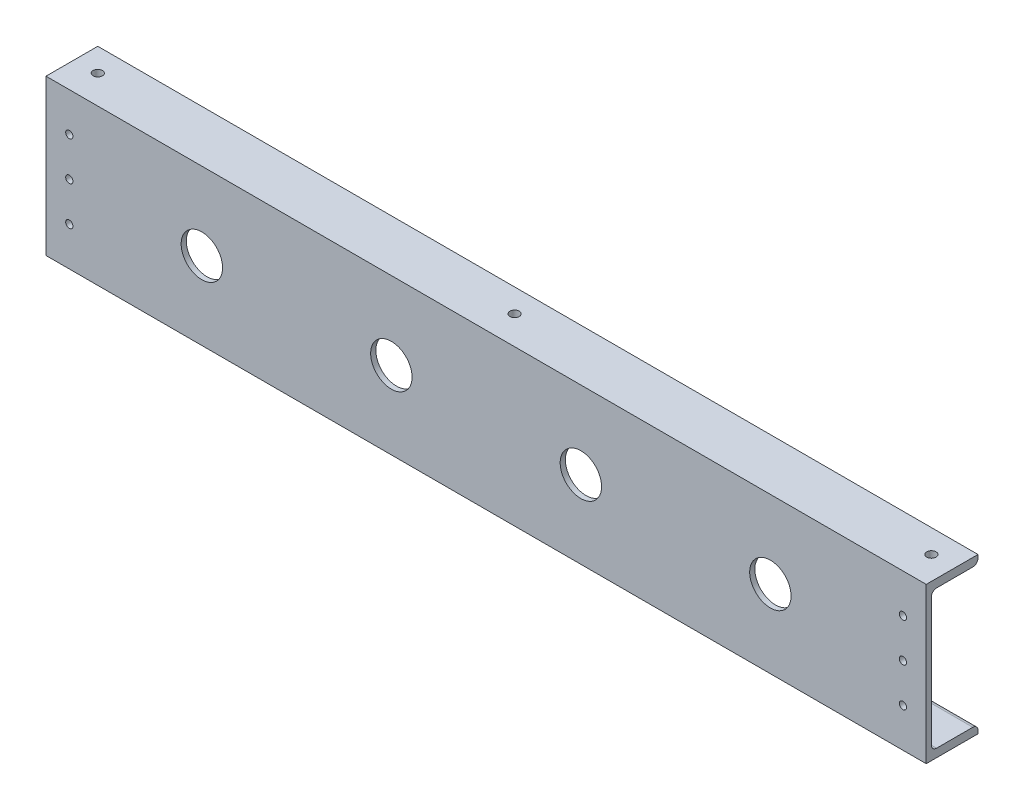
ISO-10303-21;
HEADER;
FILE_DESCRIPTION(('STEP AP214'),'2;1');
FILE_NAME('part.step','',(''),(''),'','','');
FILE_SCHEMA(('AUTOMOTIVE_DESIGN { 1 0 10303 214 1 1 1 1 }'));
ENDSEC;
DATA;
#1=APPLICATION_CONTEXT('core data for automotive mechanical design processes');
#2=APPLICATION_PROTOCOL_DEFINITION('international standard','automotive_design',2000,#1);
#3=PRODUCT_CONTEXT('',#1,'mechanical');
#4=PRODUCT('Part','Part','',(#3));
#5=PRODUCT_RELATED_PRODUCT_CATEGORY('part','',(#4));
#6=PRODUCT_DEFINITION_FORMATION('','',#4);
#7=PRODUCT_DEFINITION_CONTEXT('part definition',#1,'design');
#8=PRODUCT_DEFINITION('design','',#6,#7);
#9=PRODUCT_DEFINITION_SHAPE('','',#8);
#10=(LENGTH_UNIT() NAMED_UNIT(*) SI_UNIT(.MILLI.,.METRE.));
#11=(NAMED_UNIT(*) PLANE_ANGLE_UNIT() SI_UNIT($,.RADIAN.));
#12=(NAMED_UNIT(*) SI_UNIT($,.STERADIAN.) SOLID_ANGLE_UNIT());
#13=UNCERTAINTY_MEASURE_WITH_UNIT(LENGTH_MEASURE(1.E-05),#10,'distance_accuracy_value','');
#14=(GEOMETRIC_REPRESENTATION_CONTEXT(3) GLOBAL_UNCERTAINTY_ASSIGNED_CONTEXT((#13)) GLOBAL_UNIT_ASSIGNED_CONTEXT((#10,
#11,#12)) REPRESENTATION_CONTEXT('',''));
#15=CARTESIAN_POINT('',(0.,0.,0.));
#16=DIRECTION('',(0.,0.,1.));
#17=DIRECTION('',(1.,0.,0.));
#18=AXIS2_PLACEMENT_3D('',#15,#16,#17);
#19=CARTESIAN_POINT('',(301.,-36.1204013377926,206.622073578595));
#20=DIRECTION('',(0.,0.,-1.));
#21=DIRECTION('',(0.,1.,0.));
#22=AXIS2_PLACEMENT_3D('',#19,#20,#21);
#23=CYLINDRICAL_SURFACE('',#22,39.9999999999999);
#24=CARTESIAN_POINT('',(301.,-36.1204013377926,176.622073578595));
#25=DIRECTION('',(0.,0.,-1.));
#26=DIRECTION('',(0.,1.,0.));
#27=AXIS2_PLACEMENT_3D('',#24,#25,#26);
#28=CIRCLE('',#27,39.9999999999999);
#29=CARTESIAN_POINT('',(301.,3.87959866220729,176.622073578595));
#30=VERTEX_POINT('',#29);
#31=EDGE_CURVE('E40',#30,#30,#28,.T.);
#32=ORIENTED_EDGE('',*,*,#31,.T.);
#33=EDGE_LOOP('',(#32));
#34=FACE_BOUND('',#33,.T.);
#35=CARTESIAN_POINT('',(301.,-36.1204013377926,186.622073578595));
#36=DIRECTION('',(0.,0.,-1.));
#37=DIRECTION('',(-1.,0.,0.));
#38=AXIS2_PLACEMENT_3D('',#35,#36,#37);
#39=CIRCLE('',#38,39.9999999999999);
#40=CARTESIAN_POINT('',(261.,-36.1204013377926,186.622073578595));
#41=VERTEX_POINT('',#40);
#42=EDGE_CURVE('E11',#41,#41,#39,.T.);
#43=ORIENTED_EDGE('',*,*,#42,.F.);
#44=EDGE_LOOP('',(#43));
#45=FACE_BOUND('',#44,.T.);
#46=ADVANCED_FACE('F32',(#34,#45),#23,.F.);
#47=CARTESIAN_POINT('',(667.,-36.1204013377926,206.622073578595));
#48=DIRECTION('',(0.,0.,-1.));
#49=DIRECTION('',(0.,1.,0.));
#50=AXIS2_PLACEMENT_3D('',#47,#48,#49);
#51=CYLINDRICAL_SURFACE('',#50,39.9999999999999);
#52=CARTESIAN_POINT('',(667.,-36.1204013377926,176.622073578595));
#53=DIRECTION('',(0.,0.,-1.));
#54=DIRECTION('',(0.,1.,0.));
#55=AXIS2_PLACEMENT_3D('',#52,#53,#54);
#56=CIRCLE('',#55,39.9999999999999);
#57=CARTESIAN_POINT('',(667.,3.87959866220729,176.622073578595));
#58=VERTEX_POINT('',#57);
#59=EDGE_CURVE('E215',#58,#58,#56,.T.);
#60=ORIENTED_EDGE('',*,*,#59,.T.);
#61=EDGE_LOOP('',(#60));
#62=FACE_BOUND('',#61,.T.);
#63=CARTESIAN_POINT('',(667.,-36.1204013377926,186.622073578595));
#64=DIRECTION('',(0.,0.,-1.));
#65=DIRECTION('',(-1.,0.,0.));
#66=AXIS2_PLACEMENT_3D('',#63,#64,#65);
#67=CIRCLE('',#66,39.9999999999999);
#68=CARTESIAN_POINT('',(627.,-36.1204013377926,186.622073578595));
#69=VERTEX_POINT('',#68);
#70=EDGE_CURVE('E218',#69,#69,#67,.T.);
#71=ORIENTED_EDGE('',*,*,#70,.F.);
#72=EDGE_LOOP('',(#71));
#73=FACE_BOUND('',#72,.T.);
#74=ADVANCED_FACE('F241',(#62,#73),#51,.F.);
#75=CARTESIAN_POINT('',(1655.,93.8795986622074,131.622073578595));
#76=DIRECTION('',(0.,1.,0.));
#77=DIRECTION('',(0.,0.,1.));
#78=AXIS2_PLACEMENT_3D('',#75,#76,#77);
#79=CYLINDRICAL_SURFACE('',#78,9.00000000000001);
#80=CARTESIAN_POINT('',(1655.,113.879598662207,131.622073578595));
#81=DIRECTION('',(0.,1.,0.));
#82=DIRECTION('',(0.,0.,1.));
#83=AXIS2_PLACEMENT_3D('',#80,#81,#82);
#84=CIRCLE('',#83,9.00000000000001);
#85=CARTESIAN_POINT('',(1655.,113.879598662207,140.622073578595));
#86=VERTEX_POINT('',#85);
#87=EDGE_CURVE('E204',#86,#86,#84,.T.);
#88=ORIENTED_EDGE('',*,*,#87,.T.);
#89=EDGE_LOOP('',(#88));
#90=FACE_BOUND('',#89,.T.);
#91=CARTESIAN_POINT('',(1655.,97.8795986622074,131.622073578595));
#92=DIRECTION('',(0.,1.,0.));
#93=DIRECTION('',(0.,0.,1.));
#94=AXIS2_PLACEMENT_3D('',#91,#92,#93);
#95=CIRCLE('',#94,9.00000000000001);
#96=CARTESIAN_POINT('',(1655.,97.8795986622074,140.622073578595));
#97=VERTEX_POINT('',#96);
#98=EDGE_CURVE('E212',#97,#97,#95,.T.);
#99=ORIENTED_EDGE('',*,*,#98,.F.);
#100=EDGE_LOOP('',(#99));
#101=FACE_BOUND('',#100,.T.);
#102=ADVANCED_FACE('F245',(#90,#101),#79,.F.);
#103=CARTESIAN_POINT('',(1700.,107.879598662207,86.6220735785954));
#104=DIRECTION('',(0.,0.,1.));
#105=DIRECTION('',(1.,0.,0.));
#106=AXIS2_PLACEMENT_3D('',#103,#104,#105);
#107=PLANE('',#106);
#108=DIRECTION('',(0.,1.,0.));
#109=VECTOR('',#108,1.);
#110=CARTESIAN_POINT('',(0.,107.879598662207,86.6220735785954));
#111=LINE('',#110,#109);
#112=CARTESIAN_POINT('',(0.,107.879598662207,86.6220735785954));
#113=VERTEX_POINT('',#112);
#114=CARTESIAN_POINT('',(0.,113.879598662207,86.6220735785954));
#115=VERTEX_POINT('',#114);
#116=EDGE_CURVE('E154',#113,#115,#111,.T.);
#117=ORIENTED_EDGE('',*,*,#116,.T.);
#118=DIRECTION('',(-1.,0.,0.));
#119=VECTOR('',#118,1.);
#120=CARTESIAN_POINT('',(1700.,113.879598662207,86.6220735785954));
#121=LINE('',#120,#119);
#122=CARTESIAN_POINT('',(1700.,113.879598662207,86.6220735785954));
#123=VERTEX_POINT('',#122);
#124=EDGE_CURVE('E202',#123,#115,#121,.T.);
#125=ORIENTED_EDGE('',*,*,#124,.F.);
#126=DIRECTION('',(0.,1.,0.));
#127=VECTOR('',#126,1.);
#128=CARTESIAN_POINT('',(1700.,107.879598662207,86.6220735785954));
#129=LINE('',#128,#127);
#130=CARTESIAN_POINT('',(1700.,107.879598662207,86.6220735785954));
#131=VERTEX_POINT('',#130);
#132=EDGE_CURVE('E177',#131,#123,#129,.T.);
#133=ORIENTED_EDGE('',*,*,#132,.F.);
#134=DIRECTION('',(-1.,0.,0.));
#135=VECTOR('',#134,1.);
#136=CARTESIAN_POINT('',(1700.,107.879598662207,86.6220735785954));
#137=LINE('',#136,#135);
#138=EDGE_CURVE('E150',#131,#113,#137,.T.);
#139=ORIENTED_EDGE('',*,*,#138,.T.);
#140=EDGE_LOOP('',(#117,#125,#133,#139));
#141=FACE_BOUND('',#140,.T.);
#142=ADVANCED_FACE('F250',(#141),#107,.F.);
#143=CARTESIAN_POINT('',(1700.,113.879598662207,86.6220735785954));
#144=DIRECTION('',(0.,-1.,0.));
#145=DIRECTION('',(0.,0.,-1.));
#146=AXIS2_PLACEMENT_3D('',#143,#144,#145);
#147=PLANE('',#146);
#148=CARTESIAN_POINT('',(850.,113.879598662207,131.622073578595));
#149=DIRECTION('',(0.,1.,0.));
#150=DIRECTION('',(0.,0.,1.));
#151=AXIS2_PLACEMENT_3D('',#148,#149,#150);
#152=CIRCLE('',#151,9.00000000000001);
#153=CARTESIAN_POINT('',(850.,113.879598662207,140.622073578595));
#154=VERTEX_POINT('',#153);
#155=EDGE_CURVE('E350',#154,#154,#152,.T.);
#156=ORIENTED_EDGE('',*,*,#155,.F.);
#157=EDGE_LOOP('',(#156));
#158=FACE_BOUND('',#157,.T.);
#159=CARTESIAN_POINT('',(45.,113.879598662207,131.622073578595));
#160=DIRECTION('',(0.,1.,0.));
#161=DIRECTION('',(0.,0.,1.));
#162=AXIS2_PLACEMENT_3D('',#159,#160,#161);
#163=CIRCLE('',#162,9.00000000000001);
#164=CARTESIAN_POINT('',(45.,113.879598662207,140.622073578595));
#165=VERTEX_POINT('',#164);
#166=EDGE_CURVE('E209',#165,#165,#163,.T.);
#167=ORIENTED_EDGE('',*,*,#166,.F.);
#168=EDGE_LOOP('',(#167));
#169=FACE_BOUND('',#168,.T.);
#170=DIRECTION('',(0.,0.,1.));
#171=VECTOR('',#170,1.);
#172=CARTESIAN_POINT('',(0.,113.879598662207,86.6220735785954));
#173=LINE('',#172,#171);
#174=CARTESIAN_POINT('',(0.,113.879598662207,186.622073578595));
#175=VERTEX_POINT('',#174);
#176=EDGE_CURVE('E157',#115,#175,#173,.T.);
#177=ORIENTED_EDGE('',*,*,#176,.T.);
#178=DIRECTION('',(-1.,0.,0.));
#179=VECTOR('',#178,1.);
#180=CARTESIAN_POINT('',(1700.,113.879598662207,186.622073578595));
#181=LINE('',#180,#179);
#182=CARTESIAN_POINT('',(1700.,113.879598662207,186.622073578595));
#183=VERTEX_POINT('',#182);
#184=EDGE_CURVE('E199',#183,#175,#181,.T.);
#185=ORIENTED_EDGE('',*,*,#184,.F.);
#186=DIRECTION('',(0.,0.,1.));
#187=VECTOR('',#186,1.);
#188=CARTESIAN_POINT('',(1700.,113.879598662207,86.6220735785954));
#189=LINE('',#188,#187);
#190=EDGE_CURVE('E104',#123,#183,#189,.T.);
#191=ORIENTED_EDGE('',*,*,#190,.F.);
#192=ORIENTED_EDGE('',*,*,#124,.T.);
#193=EDGE_LOOP('',(#177,#185,#191,#192));
#194=FACE_BOUND('',#193,.T.);
#195=ORIENTED_EDGE('',*,*,#87,.F.);
#196=EDGE_LOOP('',(#195));
#197=FACE_BOUND('',#196,.T.);
#198=ADVANCED_FACE('F257',(#158,#169,#194,#197),#147,.F.);
#199=CARTESIAN_POINT('',(1700.,113.879598662207,186.622073578595));
#200=DIRECTION('',(0.,0.,-1.));
#201=DIRECTION('',(-1.,0.,0.));
#202=AXIS2_PLACEMENT_3D('',#199,#200,#201);
#203=PLANE('',#202);
#204=CARTESIAN_POINT('',(1033.,-36.1204013377926,186.622073578595));
#205=DIRECTION('',(0.,0.,-1.));
#206=DIRECTION('',(-1.,0.,0.));
#207=AXIS2_PLACEMENT_3D('',#204,#205,#206);
#208=CIRCLE('',#207,39.9999999999999);
#209=CARTESIAN_POINT('',(993.,-36.1204013377926,186.622073578595));
#210=VERTEX_POINT('',#209);
#211=EDGE_CURVE('E359',#210,#210,#208,.T.);
#212=ORIENTED_EDGE('',*,*,#211,.T.);
#213=EDGE_LOOP('',(#212));
#214=FACE_BOUND('',#213,.T.);
#215=CARTESIAN_POINT('',(1399.,-36.1204013377926,186.622073578595));
#216=DIRECTION('',(0.,0.,-1.));
#217=DIRECTION('',(-1.,0.,0.));
#218=AXIS2_PLACEMENT_3D('',#215,#216,#217);
#219=CIRCLE('',#218,39.9999999999999);
#220=CARTESIAN_POINT('',(1359.,-36.1204013377926,186.622073578595));
#221=VERTEX_POINT('',#220);
#222=EDGE_CURVE('E353',#221,#221,#219,.T.);
#223=ORIENTED_EDGE('',*,*,#222,.T.);
#224=EDGE_LOOP('',(#223));
#225=FACE_BOUND('',#224,.T.);
#226=CARTESIAN_POINT('',(44.9999999999999,38.8795986622074,186.622073578595));
#227=DIRECTION('',(0.,0.,-1.));
#228=DIRECTION('',(-1.,0.,0.));
#229=AXIS2_PLACEMENT_3D('',#226,#227,#228);
#230=CIRCLE('',#229,6.99999999999993);
#231=CARTESIAN_POINT('',(38.,38.8795986622074,186.622073578595));
#232=VERTEX_POINT('',#231);
#233=EDGE_CURVE('E340',#232,#232,#230,.T.);
#234=ORIENTED_EDGE('',*,*,#233,.T.);
#235=EDGE_LOOP('',(#234));
#236=FACE_BOUND('',#235,.T.);
#237=CARTESIAN_POINT('',(45.0000000000001,-36.1204013377926,186.622073578595));
#238=DIRECTION('',(0.,0.,-1.));
#239=DIRECTION('',(-1.,0.,0.));
#240=AXIS2_PLACEMENT_3D('',#237,#238,#239);
#241=CIRCLE('',#240,6.99999999999993);
#242=CARTESIAN_POINT('',(38.0000000000002,-36.1204013377926,186.622073578595));
#243=VERTEX_POINT('',#242);
#244=EDGE_CURVE('E334',#243,#243,#241,.T.);
#245=ORIENTED_EDGE('',*,*,#244,.T.);
#246=EDGE_LOOP('',(#245));
#247=FACE_BOUND('',#246,.T.);
#248=CARTESIAN_POINT('',(44.9999999999999,-111.120401337793,186.622073578595));
#249=DIRECTION('',(0.,0.,-1.));
#250=DIRECTION('',(-1.,0.,0.));
#251=AXIS2_PLACEMENT_3D('',#248,#249,#250);
#252=CIRCLE('',#251,6.99999999999992);
#253=CARTESIAN_POINT('',(38.,-111.120401337793,186.622073578595));
#254=VERTEX_POINT('',#253);
#255=EDGE_CURVE('E208',#254,#254,#252,.T.);
#256=ORIENTED_EDGE('',*,*,#255,.T.);
#257=EDGE_LOOP('',(#256));
#258=FACE_BOUND('',#257,.T.);
#259=CARTESIAN_POINT('',(1655.,38.8795986622074,186.622073578595));
#260=DIRECTION('',(0.,0.,1.));
#261=DIRECTION('',(1.,0.,0.));
#262=AXIS2_PLACEMENT_3D('',#259,#260,#261);
#263=CIRCLE('',#262,6.99999999999993);
#264=CARTESIAN_POINT('',(1662.,38.8795986622074,186.622073578595));
#265=VERTEX_POINT('',#264);
#266=EDGE_CURVE('E324',#265,#265,#263,.T.);
#267=ORIENTED_EDGE('',*,*,#266,.F.);
#268=EDGE_LOOP('',(#267));
#269=FACE_BOUND('',#268,.T.);
#270=CARTESIAN_POINT('',(1655.,-36.1204013377926,186.622073578595));
#271=DIRECTION('',(0.,0.,1.));
#272=DIRECTION('',(1.,0.,0.));
#273=AXIS2_PLACEMENT_3D('',#270,#271,#272);
#274=CIRCLE('',#273,6.99999999999993);
#275=CARTESIAN_POINT('',(1662.,-36.1204013377926,186.622073578595));
#276=VERTEX_POINT('',#275);
#277=EDGE_CURVE('E318',#276,#276,#274,.T.);
#278=ORIENTED_EDGE('',*,*,#277,.F.);
#279=EDGE_LOOP('',(#278));
#280=FACE_BOUND('',#279,.T.);
#281=CARTESIAN_POINT('',(1655.,-111.120401337793,186.622073578595));
#282=DIRECTION('',(0.,0.,1.));
#283=DIRECTION('',(1.,0.,0.));
#284=AXIS2_PLACEMENT_3D('',#281,#282,#283);
#285=CIRCLE('',#284,6.99999999999992);
#286=CARTESIAN_POINT('',(1662.,-111.120401337793,186.622073578595));
#287=VERTEX_POINT('',#286);
#288=EDGE_CURVE('E311',#287,#287,#285,.T.);
#289=ORIENTED_EDGE('',*,*,#288,.F.);
#290=EDGE_LOOP('',(#289));
#291=FACE_BOUND('',#290,.T.);
#292=DIRECTION('',(0.,-1.,0.));
#293=VECTOR('',#292,1.);
#294=CARTESIAN_POINT('',(0.,113.879598662207,186.622073578595));
#295=LINE('',#294,#293);
#296=CARTESIAN_POINT('',(0.,-186.120401337793,186.622073578595));
#297=VERTEX_POINT('',#296);
#298=EDGE_CURVE('E160',#175,#297,#295,.T.);
#299=ORIENTED_EDGE('',*,*,#298,.T.);
#300=DIRECTION('',(-1.,0.,0.));
#301=VECTOR('',#300,1.);
#302=CARTESIAN_POINT('',(1700.,-186.120401337793,186.622073578595));
#303=LINE('',#302,#301);
#304=CARTESIAN_POINT('',(1700.,-186.120401337793,186.622073578595));
#305=VERTEX_POINT('',#304);
#306=EDGE_CURVE('E196',#305,#297,#303,.T.);
#307=ORIENTED_EDGE('',*,*,#306,.F.);
#308=DIRECTION('',(0.,-1.,0.));
#309=VECTOR('',#308,1.);
#310=CARTESIAN_POINT('',(1700.,113.879598662207,186.622073578595));
#311=LINE('',#310,#309);
#312=EDGE_CURVE('E307',#183,#305,#311,.T.);
#313=ORIENTED_EDGE('',*,*,#312,.F.);
#314=ORIENTED_EDGE('',*,*,#184,.T.);
#315=EDGE_LOOP('',(#299,#307,#313,#314));
#316=FACE_BOUND('',#315,.T.);
#317=ORIENTED_EDGE('',*,*,#70,.T.);
#318=EDGE_LOOP('',(#317));
#319=FACE_BOUND('',#318,.T.);
#320=ORIENTED_EDGE('',*,*,#42,.T.);
#321=EDGE_LOOP('',(#320));
#322=FACE_BOUND('',#321,.T.);
#323=ADVANCED_FACE('F261',(#214,#225,#236,#247,#258,#269,#280,#291,#316,#319,#322),#203,.F.);
#324=CARTESIAN_POINT('',(1700.,-186.120401337793,186.622073578595));
#325=DIRECTION('',(0.,1.,0.));
#326=DIRECTION('',(0.,0.,1.));
#327=AXIS2_PLACEMENT_3D('',#324,#325,#326);
#328=PLANE('',#327);
#329=DIRECTION('',(0.,0.,-1.));
#330=VECTOR('',#329,1.);
#331=CARTESIAN_POINT('',(0.,-186.120401337793,186.622073578595));
#332=LINE('',#331,#330);
#333=CARTESIAN_POINT('',(0.,-186.120401337793,86.6220735785954));
#334=VERTEX_POINT('',#333);
#335=EDGE_CURVE('E162',#297,#334,#332,.T.);
#336=ORIENTED_EDGE('',*,*,#335,.T.);
#337=DIRECTION('',(-1.,0.,0.));
#338=VECTOR('',#337,1.);
#339=CARTESIAN_POINT('',(1700.,-186.120401337793,86.6220735785954));
#340=LINE('',#339,#338);
#341=CARTESIAN_POINT('',(1700.,-186.120401337793,86.6220735785954));
#342=VERTEX_POINT('',#341);
#343=EDGE_CURVE('E193',#342,#334,#340,.T.);
#344=ORIENTED_EDGE('',*,*,#343,.F.);
#345=DIRECTION('',(0.,0.,-1.));
#346=VECTOR('',#345,1.);
#347=CARTESIAN_POINT('',(1700.,-186.120401337793,186.622073578595));
#348=LINE('',#347,#346);
#349=EDGE_CURVE('E305',#305,#342,#348,.T.);
#350=ORIENTED_EDGE('',*,*,#349,.F.);
#351=ORIENTED_EDGE('',*,*,#306,.T.);
#352=EDGE_LOOP('',(#336,#344,#350,#351));
#353=FACE_BOUND('',#352,.T.);
#354=ADVANCED_FACE('F265',(#353),#328,.F.);
#355=CARTESIAN_POINT('',(1700.,-186.120401337793,86.6220735785954));
#356=DIRECTION('',(0.,0.,1.));
#357=DIRECTION('',(1.,0.,0.));
#358=AXIS2_PLACEMENT_3D('',#355,#356,#357);
#359=PLANE('',#358);
#360=DIRECTION('',(0.,1.,0.));
#361=VECTOR('',#360,1.);
#362=CARTESIAN_POINT('',(0.,-186.120401337793,86.6220735785954));
#363=LINE('',#362,#361);
#364=CARTESIAN_POINT('',(0.,-180.120401337793,86.6220735785954));
#365=VERTEX_POINT('',#364);
#366=EDGE_CURVE('E164',#334,#365,#363,.T.);
#367=ORIENTED_EDGE('',*,*,#366,.T.);
#368=DIRECTION('',(-1.,0.,0.));
#369=VECTOR('',#368,1.);
#370=CARTESIAN_POINT('',(1700.,-180.120401337793,86.6220735785954));
#371=LINE('',#370,#369);
#372=CARTESIAN_POINT('',(1700.,-180.120401337793,86.6220735785954));
#373=VERTEX_POINT('',#372);
#374=EDGE_CURVE('E190',#373,#365,#371,.T.);
#375=ORIENTED_EDGE('',*,*,#374,.F.);
#376=DIRECTION('',(0.,1.,0.));
#377=VECTOR('',#376,1.);
#378=CARTESIAN_POINT('',(1700.,-186.120401337793,86.6220735785954));
#379=LINE('',#378,#377);
#380=EDGE_CURVE('E303',#342,#373,#379,.T.);
#381=ORIENTED_EDGE('',*,*,#380,.F.);
#382=ORIENTED_EDGE('',*,*,#343,.T.);
#383=EDGE_LOOP('',(#367,#375,#381,#382));
#384=FACE_BOUND('',#383,.T.);
#385=ADVANCED_FACE('F269',(#384),#359,.F.);
#386=CARTESIAN_POINT('',(1700.,-180.120401337793,96.6220735785954));
#387=DIRECTION('',(-1.,0.,0.));
#388=DIRECTION('',(0.,0.,1.));
#389=AXIS2_PLACEMENT_3D('',#386,#387,#388);
#390=CYLINDRICAL_SURFACE('',#389,10.);
#391=CARTESIAN_POINT('',(0.,-180.120401337793,96.6220735785954));
#392=DIRECTION('',(1.,0.,0.));
#393=DIRECTION('',(0.,0.,-1.));
#394=AXIS2_PLACEMENT_3D('',#391,#392,#393);
#395=CIRCLE('',#394,10.);
#396=CARTESIAN_POINT('',(0.,-170.120401337793,96.6220735785954));
#397=VERTEX_POINT('',#396);
#398=EDGE_CURVE('E166',#365,#397,#395,.T.);
#399=ORIENTED_EDGE('',*,*,#398,.T.);
#400=DIRECTION('',(-1.,0.,0.));
#401=VECTOR('',#400,1.);
#402=CARTESIAN_POINT('',(1700.,-170.120401337793,96.6220735785954));
#403=LINE('',#402,#401);
#404=CARTESIAN_POINT('',(1700.,-170.120401337793,96.6220735785954));
#405=VERTEX_POINT('',#404);
#406=EDGE_CURVE('E187',#405,#397,#403,.T.);
#407=ORIENTED_EDGE('',*,*,#406,.F.);
#408=CARTESIAN_POINT('',(1700.,-180.120401337793,96.6220735785954));
#409=DIRECTION('',(1.,0.,0.));
#410=DIRECTION('',(0.,0.,-1.));
#411=AXIS2_PLACEMENT_3D('',#408,#409,#410);
#412=CIRCLE('',#411,10.);
#413=EDGE_CURVE('E301',#373,#405,#412,.T.);
#414=ORIENTED_EDGE('',*,*,#413,.F.);
#415=ORIENTED_EDGE('',*,*,#374,.T.);
#416=EDGE_LOOP('',(#399,#407,#414,#415));
#417=FACE_BOUND('',#416,.T.);
#418=ADVANCED_FACE('F273',(#417),#390,.T.);
#419=CARTESIAN_POINT('',(1700.,-170.120401337793,96.6220735785954));
#420=DIRECTION('',(0.,-1.,0.));
#421=DIRECTION('',(0.,0.,-1.));
#422=AXIS2_PLACEMENT_3D('',#419,#420,#421);
#423=PLANE('',#422);
#424=DIRECTION('',(0.,0.,1.));
#425=VECTOR('',#424,1.);
#426=CARTESIAN_POINT('',(0.,-170.120401337793,96.6220735785954));
#427=LINE('',#426,#425);
#428=CARTESIAN_POINT('',(0.,-170.120401337793,166.622073578595));
#429=VERTEX_POINT('',#428);
#430=EDGE_CURVE('E168',#397,#429,#427,.T.);
#431=ORIENTED_EDGE('',*,*,#430,.T.);
#432=DIRECTION('',(-1.,0.,0.));
#433=VECTOR('',#432,1.);
#434=CARTESIAN_POINT('',(1700.,-170.120401337793,166.622073578595));
#435=LINE('',#434,#433);
#436=CARTESIAN_POINT('',(1700.,-170.120401337793,166.622073578595));
#437=VERTEX_POINT('',#436);
#438=EDGE_CURVE('E184',#437,#429,#435,.T.);
#439=ORIENTED_EDGE('',*,*,#438,.F.);
#440=DIRECTION('',(0.,0.,1.));
#441=VECTOR('',#440,1.);
#442=CARTESIAN_POINT('',(1700.,-170.120401337793,96.6220735785954));
#443=LINE('',#442,#441);
#444=EDGE_CURVE('E297',#405,#437,#443,.T.);
#445=ORIENTED_EDGE('',*,*,#444,.F.);
#446=ORIENTED_EDGE('',*,*,#406,.T.);
#447=EDGE_LOOP('',(#431,#439,#445,#446));
#448=FACE_BOUND('',#447,.T.);
#449=ADVANCED_FACE('F235',(#448),#423,.F.);
#450=CARTESIAN_POINT('',(1700.,-160.120401337793,166.622073578595));
#451=DIRECTION('',(-1.,0.,0.));
#452=DIRECTION('',(0.,0.,1.));
#453=AXIS2_PLACEMENT_3D('',#450,#451,#452);
#454=CYLINDRICAL_SURFACE('',#453,10.);
#455=CARTESIAN_POINT('',(0.,-160.120401337793,166.622073578595));
#456=DIRECTION('',(-1.,0.,0.));
#457=DIRECTION('',(0.,0.,1.));
#458=AXIS2_PLACEMENT_3D('',#455,#456,#457);
#459=CIRCLE('',#458,10.);
#460=CARTESIAN_POINT('',(0.,-160.120401337793,176.622073578595));
#461=VERTEX_POINT('',#460);
#462=EDGE_CURVE('E170',#429,#461,#459,.T.);
#463=ORIENTED_EDGE('',*,*,#462,.T.);
#464=DIRECTION('',(-1.,0.,0.));
#465=VECTOR('',#464,1.);
#466=CARTESIAN_POINT('',(1700.,-160.120401337793,176.622073578595));
#467=LINE('',#466,#465);
#468=CARTESIAN_POINT('',(1700.,-160.120401337793,176.622073578595));
#469=VERTEX_POINT('',#468);
#470=EDGE_CURVE('E181',#469,#461,#467,.T.);
#471=ORIENTED_EDGE('',*,*,#470,.F.);
#472=CARTESIAN_POINT('',(1700.,-160.120401337793,166.622073578595));
#473=DIRECTION('',(-1.,0.,0.));
#474=DIRECTION('',(0.,0.,1.));
#475=AXIS2_PLACEMENT_3D('',#472,#473,#474);
#476=CIRCLE('',#475,10.);
#477=EDGE_CURVE('E291',#437,#469,#476,.T.);
#478=ORIENTED_EDGE('',*,*,#477,.F.);
#479=ORIENTED_EDGE('',*,*,#438,.T.);
#480=EDGE_LOOP('',(#463,#471,#478,#479));
#481=FACE_BOUND('',#480,.T.);
#482=ADVANCED_FACE('F227',(#481),#454,.F.);
#483=CARTESIAN_POINT('',(1700.,-160.120401337793,176.622073578595));
#484=DIRECTION('',(0.,0.,1.));
#485=DIRECTION('',(0.,-1.,0.));
#486=AXIS2_PLACEMENT_3D('',#483,#484,#485);
#487=PLANE('',#486);
#488=CARTESIAN_POINT('',(1033.,-36.1204013377926,176.622073578595));
#489=DIRECTION('',(0.,0.,-1.));
#490=DIRECTION('',(0.,1.,0.));
#491=AXIS2_PLACEMENT_3D('',#488,#489,#490);
#492=CIRCLE('',#491,39.9999999999999);
#493=CARTESIAN_POINT('',(1033.,3.87959866220729,176.622073578595));
#494=VERTEX_POINT('',#493);
#495=EDGE_CURVE('E362',#494,#494,#492,.T.);
#496=ORIENTED_EDGE('',*,*,#495,.F.);
#497=EDGE_LOOP('',(#496));
#498=FACE_BOUND('',#497,.T.);
#499=CARTESIAN_POINT('',(1399.,-36.1204013377926,176.622073578595));
#500=DIRECTION('',(0.,0.,-1.));
#501=DIRECTION('',(0.,1.,0.));
#502=AXIS2_PLACEMENT_3D('',#499,#500,#501);
#503=CIRCLE('',#502,39.9999999999999);
#504=CARTESIAN_POINT('',(1399.,3.87959866220729,176.622073578595));
#505=VERTEX_POINT('',#504);
#506=EDGE_CURVE('E356',#505,#505,#503,.T.);
#507=ORIENTED_EDGE('',*,*,#506,.F.);
#508=EDGE_LOOP('',(#507));
#509=FACE_BOUND('',#508,.T.);
#510=CARTESIAN_POINT('',(44.9999999999999,38.8795986622074,176.622073578595));
#511=DIRECTION('',(0.,0.,-1.));
#512=DIRECTION('',(-1.,0.,0.));
#513=AXIS2_PLACEMENT_3D('',#510,#511,#512);
#514=CIRCLE('',#513,6.99999999999993);
#515=CARTESIAN_POINT('',(38.,38.8795986622074,176.622073578595));
#516=VERTEX_POINT('',#515);
#517=EDGE_CURVE('E315',#516,#516,#514,.T.);
#518=ORIENTED_EDGE('',*,*,#517,.F.);
#519=EDGE_LOOP('',(#518));
#520=FACE_BOUND('',#519,.T.);
#521=CARTESIAN_POINT('',(45.0000000000001,-36.1204013377926,176.622073578595));
#522=DIRECTION('',(0.,0.,-1.));
#523=DIRECTION('',(-1.,0.,0.));
#524=AXIS2_PLACEMENT_3D('',#521,#522,#523);
#525=CIRCLE('',#524,6.99999999999993);
#526=CARTESIAN_POINT('',(38.0000000000002,-36.1204013377926,176.622073578595));
#527=VERTEX_POINT('',#526);
#528=EDGE_CURVE('E337',#527,#527,#525,.T.);
#529=ORIENTED_EDGE('',*,*,#528,.F.);
#530=EDGE_LOOP('',(#529));
#531=FACE_BOUND('',#530,.T.);
#532=CARTESIAN_POINT('',(44.9999999999999,-111.120401337793,176.622073578595));
#533=DIRECTION('',(0.,0.,-1.));
#534=DIRECTION('',(-1.,0.,0.));
#535=AXIS2_PLACEMENT_3D('',#532,#533,#534);
#536=CIRCLE('',#535,6.99999999999992);
#537=CARTESIAN_POINT('',(38.,-111.120401337793,176.622073578595));
#538=VERTEX_POINT('',#537);
#539=EDGE_CURVE('E331',#538,#538,#536,.T.);
#540=ORIENTED_EDGE('',*,*,#539,.F.);
#541=EDGE_LOOP('',(#540));
#542=FACE_BOUND('',#541,.T.);
#543=CARTESIAN_POINT('',(1655.,38.8795986622074,176.622073578595));
#544=DIRECTION('',(0.,0.,1.));
#545=DIRECTION('',(1.,0.,0.));
#546=AXIS2_PLACEMENT_3D('',#543,#544,#545);
#547=CIRCLE('',#546,6.99999999999993);
#548=CARTESIAN_POINT('',(1662.,38.8795986622074,176.622073578595));
#549=VERTEX_POINT('',#548);
#550=EDGE_CURVE('E158',#549,#549,#547,.T.);
#551=ORIENTED_EDGE('',*,*,#550,.T.);
#552=EDGE_LOOP('',(#551));
#553=FACE_BOUND('',#552,.T.);
#554=CARTESIAN_POINT('',(1655.,-36.1204013377926,176.622073578595));
#555=DIRECTION('',(0.,0.,1.));
#556=DIRECTION('',(1.,0.,0.));
#557=AXIS2_PLACEMENT_3D('',#554,#555,#556);
#558=CIRCLE('',#557,6.99999999999993);
#559=CARTESIAN_POINT('',(1662.,-36.1204013377926,176.622073578595));
#560=VERTEX_POINT('',#559);
#561=EDGE_CURVE('E321',#560,#560,#558,.T.);
#562=ORIENTED_EDGE('',*,*,#561,.T.);
#563=EDGE_LOOP('',(#562));
#564=FACE_BOUND('',#563,.T.);
#565=CARTESIAN_POINT('',(1655.,-111.120401337793,176.622073578595));
#566=DIRECTION('',(0.,0.,1.));
#567=DIRECTION('',(1.,0.,0.));
#568=AXIS2_PLACEMENT_3D('',#565,#566,#567);
#569=CIRCLE('',#568,6.99999999999992);
#570=CARTESIAN_POINT('',(1662.,-111.120401337793,176.622073578595));
#571=VERTEX_POINT('',#570);
#572=EDGE_CURVE('E314',#571,#571,#569,.T.);
#573=ORIENTED_EDGE('',*,*,#572,.T.);
#574=EDGE_LOOP('',(#573));
#575=FACE_BOUND('',#574,.T.);
#576=DIRECTION('',(0.,1.,0.));
#577=VECTOR('',#576,1.);
#578=CARTESIAN_POINT('',(0.,-160.120401337793,176.622073578595));
#579=LINE('',#578,#577);
#580=CARTESIAN_POINT('',(0.,87.8795986622073,176.622073578595));
#581=VERTEX_POINT('',#580);
#582=EDGE_CURVE('E172',#461,#581,#579,.T.);
#583=ORIENTED_EDGE('',*,*,#582,.T.);
#584=DIRECTION('',(-1.,0.,0.));
#585=VECTOR('',#584,1.);
#586=CARTESIAN_POINT('',(1700.,87.8795986622073,176.622073578595));
#587=LINE('',#586,#585);
#588=CARTESIAN_POINT('',(1700.,87.8795986622073,176.622073578595));
#589=VERTEX_POINT('',#588);
#590=EDGE_CURVE('E144',#589,#581,#587,.T.);
#591=ORIENTED_EDGE('',*,*,#590,.F.);
#592=DIRECTION('',(0.,1.,0.));
#593=VECTOR('',#592,1.);
#594=CARTESIAN_POINT('',(1700.,-160.120401337793,176.622073578595));
#595=LINE('',#594,#593);
#596=EDGE_CURVE('E135',#469,#589,#595,.T.);
#597=ORIENTED_EDGE('',*,*,#596,.F.);
#598=ORIENTED_EDGE('',*,*,#470,.T.);
#599=EDGE_LOOP('',(#583,#591,#597,#598));
#600=FACE_BOUND('',#599,.T.);
#601=ORIENTED_EDGE('',*,*,#59,.F.);
#602=EDGE_LOOP('',(#601));
#603=FACE_BOUND('',#602,.T.);
#604=ORIENTED_EDGE('',*,*,#31,.F.);
#605=EDGE_LOOP('',(#604));
#606=FACE_BOUND('',#605,.T.);
#607=ADVANCED_FACE('F225',(#498,#509,#520,#531,#542,#553,#564,#575,#600,#603,#606),#487,.F.);
#608=CARTESIAN_POINT('',(1700.,87.8795986622074,166.622073578595));
#609=DIRECTION('',(-1.,0.,0.));
#610=DIRECTION('',(0.,0.,1.));
#611=AXIS2_PLACEMENT_3D('',#608,#609,#610);
#612=CYLINDRICAL_SURFACE('',#611,10.);
#613=CARTESIAN_POINT('',(0.,87.8795986622074,166.622073578595));
#614=DIRECTION('',(-1.,0.,0.));
#615=DIRECTION('',(0.,0.,1.));
#616=AXIS2_PLACEMENT_3D('',#613,#614,#615);
#617=CIRCLE('',#616,10.);
#618=CARTESIAN_POINT('',(0.,97.8795986622074,166.622073578595));
#619=VERTEX_POINT('',#618);
#620=EDGE_CURVE('E143',#581,#619,#617,.T.);
#621=ORIENTED_EDGE('',*,*,#620,.T.);
#622=DIRECTION('',(-1.,0.,0.));
#623=VECTOR('',#622,1.);
#624=CARTESIAN_POINT('',(1700.,97.8795986622074,166.622073578595));
#625=LINE('',#624,#623);
#626=CARTESIAN_POINT('',(1700.,97.8795986622074,166.622073578595));
#627=VERTEX_POINT('',#626);
#628=EDGE_CURVE('E140',#627,#619,#625,.T.);
#629=ORIENTED_EDGE('',*,*,#628,.F.);
#630=CARTESIAN_POINT('',(1700.,87.8795986622074,166.622073578595));
#631=DIRECTION('',(-1.,0.,0.));
#632=DIRECTION('',(0.,0.,1.));
#633=AXIS2_PLACEMENT_3D('',#630,#631,#632);
#634=CIRCLE('',#633,10.);
#635=EDGE_CURVE('E129',#589,#627,#634,.T.);
#636=ORIENTED_EDGE('',*,*,#635,.F.);
#637=ORIENTED_EDGE('',*,*,#590,.T.);
#638=EDGE_LOOP('',(#621,#629,#636,#637));
#639=FACE_BOUND('',#638,.T.);
#640=ADVANCED_FACE('F141',(#639),#612,.F.);
#641=CARTESIAN_POINT('',(1700.,97.8795986622074,166.622073578595));
#642=DIRECTION('',(0.,1.,0.));
#643=DIRECTION('',(0.,0.,1.));
#644=AXIS2_PLACEMENT_3D('',#641,#642,#643);
#645=PLANE('',#644);
#646=CARTESIAN_POINT('',(850.,97.8795986622074,131.622073578595));
#647=DIRECTION('',(0.,1.,0.));
#648=DIRECTION('',(0.,0.,1.));
#649=AXIS2_PLACEMENT_3D('',#646,#647,#648);
#650=CIRCLE('',#649,9.00000000000001);
#651=CARTESIAN_POINT('',(850.,97.8795986622074,140.622073578595));
#652=VERTEX_POINT('',#651);
#653=EDGE_CURVE('E347',#652,#652,#650,.T.);
#654=ORIENTED_EDGE('',*,*,#653,.T.);
#655=EDGE_LOOP('',(#654));
#656=FACE_BOUND('',#655,.T.);
#657=CARTESIAN_POINT('',(45.,97.8795986622074,131.622073578595));
#658=DIRECTION('',(0.,1.,0.));
#659=DIRECTION('',(0.,0.,1.));
#660=AXIS2_PLACEMENT_3D('',#657,#658,#659);
#661=CIRCLE('',#660,9.00000000000001);
#662=CARTESIAN_POINT('',(45.,97.8795986622074,140.622073578595));
#663=VERTEX_POINT('',#662);
#664=EDGE_CURVE('E205',#663,#663,#661,.T.);
#665=ORIENTED_EDGE('',*,*,#664,.T.);
#666=EDGE_LOOP('',(#665));
#667=FACE_BOUND('',#666,.T.);
#668=DIRECTION('',(0.,0.,-1.));
#669=VECTOR('',#668,1.);
#670=CARTESIAN_POINT('',(0.,97.8795986622074,166.622073578595));
#671=LINE('',#670,#669);
#672=CARTESIAN_POINT('',(0.,97.8795986622074,96.6220735785955));
#673=VERTEX_POINT('',#672);
#674=EDGE_CURVE('E89',#619,#673,#671,.T.);
#675=ORIENTED_EDGE('',*,*,#674,.T.);
#676=DIRECTION('',(-1.,0.,0.));
#677=VECTOR('',#676,1.);
#678=CARTESIAN_POINT('',(1700.,97.8795986622074,96.6220735785955));
#679=LINE('',#678,#677);
#680=CARTESIAN_POINT('',(1700.,97.8795986622074,96.6220735785955));
#681=VERTEX_POINT('',#680);
#682=EDGE_CURVE('E145',#681,#673,#679,.T.);
#683=ORIENTED_EDGE('',*,*,#682,.F.);
#684=DIRECTION('',(0.,0.,-1.));
#685=VECTOR('',#684,1.);
#686=CARTESIAN_POINT('',(1700.,97.8795986622074,166.622073578595));
#687=LINE('',#686,#685);
#688=EDGE_CURVE('E133',#627,#681,#687,.T.);
#689=ORIENTED_EDGE('',*,*,#688,.F.);
#690=ORIENTED_EDGE('',*,*,#628,.T.);
#691=EDGE_LOOP('',(#675,#683,#689,#690));
#692=FACE_BOUND('',#691,.T.);
#693=ORIENTED_EDGE('',*,*,#98,.T.);
#694=EDGE_LOOP('',(#693));
#695=FACE_BOUND('',#694,.T.);
#696=ADVANCED_FACE('F147',(#656,#667,#692,#695),#645,.F.);
#697=CARTESIAN_POINT('',(1700.,107.879598662207,96.6220735785954));
#698=DIRECTION('',(-1.,0.,0.));
#699=DIRECTION('',(0.,0.,1.));
#700=AXIS2_PLACEMENT_3D('',#697,#698,#699);
#701=CYLINDRICAL_SURFACE('',#700,9.99999999999999);
#702=CARTESIAN_POINT('',(0.,107.879598662207,96.6220735785954));
#703=DIRECTION('',(1.,0.,0.));
#704=DIRECTION('',(0.,0.,-1.));
#705=AXIS2_PLACEMENT_3D('',#702,#703,#704);
#706=CIRCLE('',#705,9.99999999999999);
#707=EDGE_CURVE('E95',#673,#113,#706,.T.);
#708=ORIENTED_EDGE('',*,*,#707,.T.);
#709=ORIENTED_EDGE('',*,*,#138,.F.);
#710=CARTESIAN_POINT('',(1700.,107.879598662207,96.6220735785954));
#711=DIRECTION('',(1.,0.,0.));
#712=DIRECTION('',(0.,0.,-1.));
#713=AXIS2_PLACEMENT_3D('',#710,#711,#712);
#714=CIRCLE('',#713,9.99999999999999);
#715=EDGE_CURVE('E48',#681,#131,#714,.T.);
#716=ORIENTED_EDGE('',*,*,#715,.F.);
#717=ORIENTED_EDGE('',*,*,#682,.T.);
#718=EDGE_LOOP('',(#708,#709,#716,#717));
#719=FACE_BOUND('',#718,.T.);
#720=ADVANCED_FACE('F403',(#719),#701,.T.);
#721=CARTESIAN_POINT('',(1700.,-180.120401337793,96.6220735785954));
#722=DIRECTION('',(1.,0.,0.));
#723=DIRECTION('',(0.,0.,-1.));
#724=AXIS2_PLACEMENT_3D('',#721,#722,#723);
#725=PLANE('',#724);
#726=ORIENTED_EDGE('',*,*,#132,.T.);
#727=ORIENTED_EDGE('',*,*,#190,.T.);
#728=ORIENTED_EDGE('',*,*,#312,.T.);
#729=ORIENTED_EDGE('',*,*,#349,.T.);
#730=ORIENTED_EDGE('',*,*,#380,.T.);
#731=ORIENTED_EDGE('',*,*,#413,.T.);
#732=ORIENTED_EDGE('',*,*,#444,.T.);
#733=ORIENTED_EDGE('',*,*,#477,.T.);
#734=ORIENTED_EDGE('',*,*,#596,.T.);
#735=ORIENTED_EDGE('',*,*,#635,.T.);
#736=ORIENTED_EDGE('',*,*,#688,.T.);
#737=ORIENTED_EDGE('',*,*,#715,.T.);
#738=EDGE_LOOP('',(#726,#727,#728,#729,#730,#731,#732,#733,#734,#735,#736,#737));
#739=FACE_BOUND('',#738,.T.);
#740=ADVANCED_FACE('F131',(#739),#725,.T.);
#741=CARTESIAN_POINT('',(0.,-180.120401337793,96.6220735785954));
#742=DIRECTION('',(1.,0.,0.));
#743=DIRECTION('',(0.,0.,-1.));
#744=AXIS2_PLACEMENT_3D('',#741,#742,#743);
#745=PLANE('',#744);
#746=ORIENTED_EDGE('',*,*,#116,.F.);
#747=ORIENTED_EDGE('',*,*,#707,.F.);
#748=ORIENTED_EDGE('',*,*,#674,.F.);
#749=ORIENTED_EDGE('',*,*,#620,.F.);
#750=ORIENTED_EDGE('',*,*,#582,.F.);
#751=ORIENTED_EDGE('',*,*,#462,.F.);
#752=ORIENTED_EDGE('',*,*,#430,.F.);
#753=ORIENTED_EDGE('',*,*,#398,.F.);
#754=ORIENTED_EDGE('',*,*,#366,.F.);
#755=ORIENTED_EDGE('',*,*,#335,.F.);
#756=ORIENTED_EDGE('',*,*,#298,.F.);
#757=ORIENTED_EDGE('',*,*,#176,.F.);
#758=EDGE_LOOP('',(#746,#747,#748,#749,#750,#751,#752,#753,#754,#755,#756,#757));
#759=FACE_BOUND('',#758,.T.);
#760=ADVANCED_FACE('F294',(#759),#745,.F.);
#761=CARTESIAN_POINT('',(1655.,-111.120401337793,176.622073578595));
#762=DIRECTION('',(0.,0.,1.));
#763=DIRECTION('',(1.,0.,0.));
#764=AXIS2_PLACEMENT_3D('',#761,#762,#763);
#765=CYLINDRICAL_SURFACE('',#764,6.99999999999992);
#766=ORIENTED_EDGE('',*,*,#572,.F.);
#767=EDGE_LOOP('',(#766));
#768=FACE_BOUND('',#767,.T.);
#769=ORIENTED_EDGE('',*,*,#288,.T.);
#770=EDGE_LOOP('',(#769));
#771=FACE_BOUND('',#770,.T.);
#772=ADVANCED_FACE('F415',(#768,#771),#765,.F.);
#773=CARTESIAN_POINT('',(1655.,-36.1204013377926,176.622073578595));
#774=DIRECTION('',(0.,0.,1.));
#775=DIRECTION('',(1.,0.,0.));
#776=AXIS2_PLACEMENT_3D('',#773,#774,#775);
#777=CYLINDRICAL_SURFACE('',#776,6.99999999999993);
#778=ORIENTED_EDGE('',*,*,#561,.F.);
#779=EDGE_LOOP('',(#778));
#780=FACE_BOUND('',#779,.T.);
#781=ORIENTED_EDGE('',*,*,#277,.T.);
#782=EDGE_LOOP('',(#781));
#783=FACE_BOUND('',#782,.T.);
#784=ADVANCED_FACE('F419',(#780,#783),#777,.F.);
#785=CARTESIAN_POINT('',(1655.,38.8795986622074,176.622073578595));
#786=DIRECTION('',(0.,0.,1.));
#787=DIRECTION('',(1.,0.,0.));
#788=AXIS2_PLACEMENT_3D('',#785,#786,#787);
#789=CYLINDRICAL_SURFACE('',#788,6.99999999999993);
#790=ORIENTED_EDGE('',*,*,#550,.F.);
#791=EDGE_LOOP('',(#790));
#792=FACE_BOUND('',#791,.T.);
#793=ORIENTED_EDGE('',*,*,#266,.T.);
#794=EDGE_LOOP('',(#793));
#795=FACE_BOUND('',#794,.T.);
#796=ADVANCED_FACE('F423',(#792,#795),#789,.F.);
#797=CARTESIAN_POINT('',(44.9999999999999,-111.120401337793,176.622073578595));
#798=DIRECTION('',(0.,0.,1.));
#799=DIRECTION('',(1.,0.,0.));
#800=AXIS2_PLACEMENT_3D('',#797,#798,#799);
#801=CYLINDRICAL_SURFACE('',#800,6.99999999999992);
#802=ORIENTED_EDGE('',*,*,#539,.T.);
#803=EDGE_LOOP('',(#802));
#804=FACE_BOUND('',#803,.T.);
#805=ORIENTED_EDGE('',*,*,#255,.F.);
#806=EDGE_LOOP('',(#805));
#807=FACE_BOUND('',#806,.T.);
#808=ADVANCED_FACE('F427',(#804,#807),#801,.F.);
#809=CARTESIAN_POINT('',(45.0000000000001,-36.1204013377926,176.622073578595));
#810=DIRECTION('',(0.,0.,1.));
#811=DIRECTION('',(1.,0.,0.));
#812=AXIS2_PLACEMENT_3D('',#809,#810,#811);
#813=CYLINDRICAL_SURFACE('',#812,6.99999999999993);
#814=ORIENTED_EDGE('',*,*,#528,.T.);
#815=EDGE_LOOP('',(#814));
#816=FACE_BOUND('',#815,.T.);
#817=ORIENTED_EDGE('',*,*,#244,.F.);
#818=EDGE_LOOP('',(#817));
#819=FACE_BOUND('',#818,.T.);
#820=ADVANCED_FACE('F431',(#816,#819),#813,.F.);
#821=CARTESIAN_POINT('',(44.9999999999999,38.8795986622074,176.622073578595));
#822=DIRECTION('',(0.,0.,1.));
#823=DIRECTION('',(1.,0.,0.));
#824=AXIS2_PLACEMENT_3D('',#821,#822,#823);
#825=CYLINDRICAL_SURFACE('',#824,6.99999999999993);
#826=ORIENTED_EDGE('',*,*,#517,.T.);
#827=EDGE_LOOP('',(#826));
#828=FACE_BOUND('',#827,.T.);
#829=ORIENTED_EDGE('',*,*,#233,.F.);
#830=EDGE_LOOP('',(#829));
#831=FACE_BOUND('',#830,.T.);
#832=ADVANCED_FACE('F435',(#828,#831),#825,.F.);
#833=CARTESIAN_POINT('',(45.,93.8795986622074,131.622073578595));
#834=DIRECTION('',(0.,1.,0.));
#835=DIRECTION('',(0.,0.,1.));
#836=AXIS2_PLACEMENT_3D('',#833,#834,#835);
#837=CYLINDRICAL_SURFACE('',#836,9.00000000000001);
#838=ORIENTED_EDGE('',*,*,#166,.T.);
#839=EDGE_LOOP('',(#838));
#840=FACE_BOUND('',#839,.T.);
#841=ORIENTED_EDGE('',*,*,#664,.F.);
#842=EDGE_LOOP('',(#841));
#843=FACE_BOUND('',#842,.T.);
#844=ADVANCED_FACE('F439',(#840,#843),#837,.F.);
#845=CARTESIAN_POINT('',(850.,93.8795986622074,131.622073578595));
#846=DIRECTION('',(0.,1.,0.));
#847=DIRECTION('',(0.,0.,1.));
#848=AXIS2_PLACEMENT_3D('',#845,#846,#847);
#849=CYLINDRICAL_SURFACE('',#848,9.00000000000001);
#850=ORIENTED_EDGE('',*,*,#155,.T.);
#851=EDGE_LOOP('',(#850));
#852=FACE_BOUND('',#851,.T.);
#853=ORIENTED_EDGE('',*,*,#653,.F.);
#854=EDGE_LOOP('',(#853));
#855=FACE_BOUND('',#854,.T.);
#856=ADVANCED_FACE('F443',(#852,#855),#849,.F.);
#857=CARTESIAN_POINT('',(1399.,-36.1204013377926,206.622073578595));
#858=DIRECTION('',(0.,0.,-1.));
#859=DIRECTION('',(0.,1.,0.));
#860=AXIS2_PLACEMENT_3D('',#857,#858,#859);
#861=CYLINDRICAL_SURFACE('',#860,39.9999999999999);
#862=ORIENTED_EDGE('',*,*,#506,.T.);
#863=EDGE_LOOP('',(#862));
#864=FACE_BOUND('',#863,.T.);
#865=ORIENTED_EDGE('',*,*,#222,.F.);
#866=EDGE_LOOP('',(#865));
#867=FACE_BOUND('',#866,.T.);
#868=ADVANCED_FACE('F368',(#864,#867),#861,.F.);
#869=CARTESIAN_POINT('',(1033.,-36.1204013377926,206.622073578595));
#870=DIRECTION('',(0.,0.,-1.));
#871=DIRECTION('',(0.,1.,0.));
#872=AXIS2_PLACEMENT_3D('',#869,#870,#871);
#873=CYLINDRICAL_SURFACE('',#872,39.9999999999999);
#874=ORIENTED_EDGE('',*,*,#495,.T.);
#875=EDGE_LOOP('',(#874));
#876=FACE_BOUND('',#875,.T.);
#877=ORIENTED_EDGE('',*,*,#211,.F.);
#878=EDGE_LOOP('',(#877));
#879=FACE_BOUND('',#878,.T.);
#880=ADVANCED_FACE('F365',(#876,#879),#873,.F.);
#881=CLOSED_SHELL('',(#46,#74,#102,#142,#198,#323,#354,#385,#418,#449,#482,#607,#640,#696,#720,
#740,#760,#772,#784,#796,#808,#820,#832,#844,#856,#868,#880));
#882=MANIFOLD_SOLID_BREP('B2',#881);
#883=ADVANCED_BREP_SHAPE_REPRESENTATION('',(#18,#882),#14);
#884=SHAPE_DEFINITION_REPRESENTATION(#9,#883);
ENDSEC;
END-ISO-10303-21;
